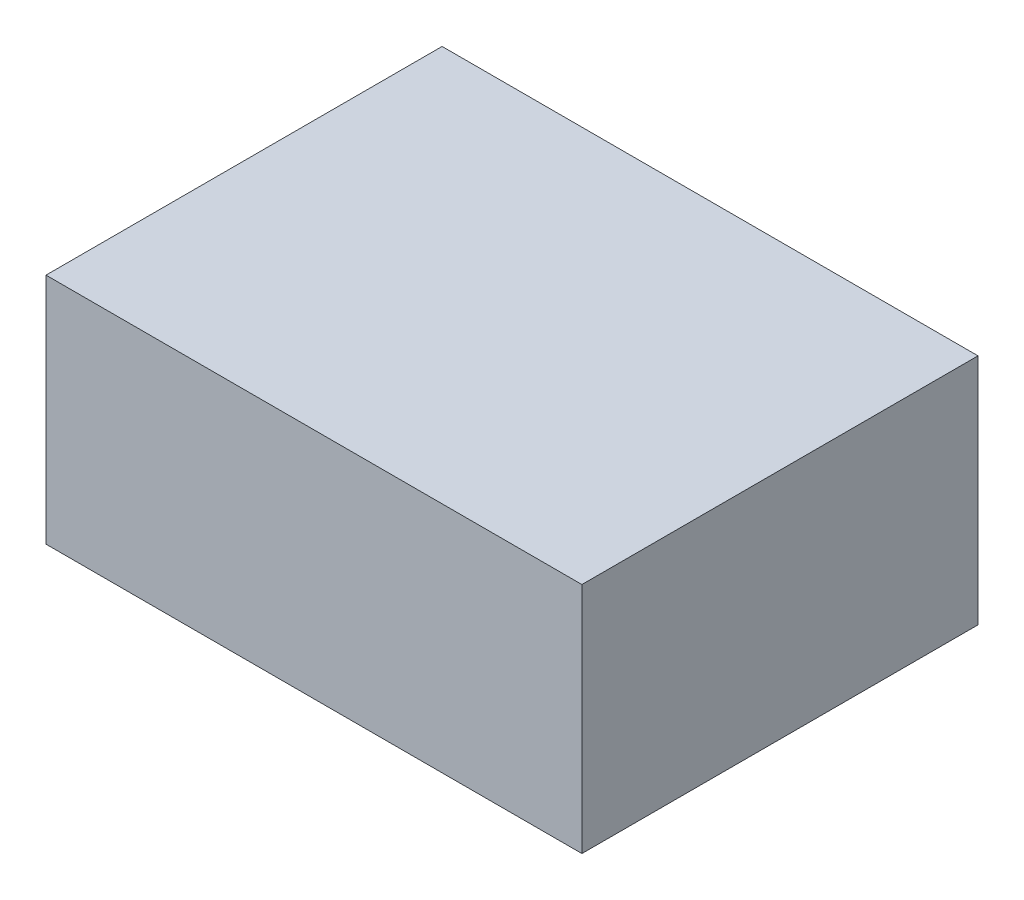
ISO-10303-21;
HEADER;
FILE_DESCRIPTION(('STEP AP214'),'2;1');
FILE_NAME('part.step','',(''),(''),'','','');
FILE_SCHEMA(('AUTOMOTIVE_DESIGN { 1 0 10303 214 1 1 1 1 }'));
ENDSEC;
DATA;
#1=APPLICATION_CONTEXT('core data for automotive mechanical design processes');
#2=APPLICATION_PROTOCOL_DEFINITION('international standard','automotive_design',2000,#1);
#3=PRODUCT_CONTEXT('',#1,'mechanical');
#4=PRODUCT('Part','Part','',(#3));
#5=PRODUCT_RELATED_PRODUCT_CATEGORY('part','',(#4));
#6=PRODUCT_DEFINITION_FORMATION('','',#4);
#7=PRODUCT_DEFINITION_CONTEXT('part definition',#1,'design');
#8=PRODUCT_DEFINITION('design','',#6,#7);
#9=PRODUCT_DEFINITION_SHAPE('','',#8);
#10=(LENGTH_UNIT() NAMED_UNIT(*) SI_UNIT(.MILLI.,.METRE.));
#11=(NAMED_UNIT(*) PLANE_ANGLE_UNIT() SI_UNIT($,.RADIAN.));
#12=(NAMED_UNIT(*) SI_UNIT($,.STERADIAN.) SOLID_ANGLE_UNIT());
#13=UNCERTAINTY_MEASURE_WITH_UNIT(LENGTH_MEASURE(1.E-05),#10,'distance_accuracy_value','');
#14=(GEOMETRIC_REPRESENTATION_CONTEXT(3) GLOBAL_UNCERTAINTY_ASSIGNED_CONTEXT((#13)) GLOBAL_UNIT_ASSIGNED_CONTEXT((#10,
#11,#12)) REPRESENTATION_CONTEXT('',''));
#15=CARTESIAN_POINT('',(0.,0.,0.));
#16=DIRECTION('',(0.,0.,1.));
#17=DIRECTION('',(1.,0.,0.));
#18=AXIS2_PLACEMENT_3D('',#15,#16,#17);
#19=CARTESIAN_POINT('',(0.,100.,0.));
#20=DIRECTION('',(1.,0.,0.));
#21=DIRECTION('',(0.,0.,-1.));
#22=AXIS2_PLACEMENT_3D('',#19,#20,#21);
#23=PLANE('',#22);
#24=DIRECTION('',(0.,0.,1.));
#25=VECTOR('',#24,1.);
#26=CARTESIAN_POINT('',(0.,0.,0.));
#27=LINE('',#26,#25);
#28=CARTESIAN_POINT('',(0.,0.,0.));
#29=VERTEX_POINT('',#28);
#30=CARTESIAN_POINT('',(1.36002320516582E-12,0.,170.));
#31=VERTEX_POINT('',#30);
#32=EDGE_CURVE('E110',#29,#31,#27,.T.);
#33=ORIENTED_EDGE('',*,*,#32,.T.);
#34=DIRECTION('',(0.,-1.,0.));
#35=VECTOR('',#34,1.);
#36=CARTESIAN_POINT('',(1.36002320516582E-12,100.,170.));
#37=LINE('',#36,#35);
#38=CARTESIAN_POINT('',(1.36002320516582E-12,100.,170.));
#39=VERTEX_POINT('',#38);
#40=EDGE_CURVE('E11',#39,#31,#37,.T.);
#41=ORIENTED_EDGE('',*,*,#40,.F.);
#42=DIRECTION('',(0.,0.,1.));
#43=VECTOR('',#42,1.);
#44=CARTESIAN_POINT('',(0.,100.,0.));
#45=LINE('',#44,#43);
#46=CARTESIAN_POINT('',(0.,100.,0.));
#47=VERTEX_POINT('',#46);
#48=EDGE_CURVE('E98',#47,#39,#45,.T.);
#49=ORIENTED_EDGE('',*,*,#48,.F.);
#50=DIRECTION('',(0.,-1.,0.));
#51=VECTOR('',#50,1.);
#52=CARTESIAN_POINT('',(0.,100.,0.));
#53=LINE('',#52,#51);
#54=EDGE_CURVE('E106',#47,#29,#53,.T.);
#55=ORIENTED_EDGE('',*,*,#54,.T.);
#56=EDGE_LOOP('',(#33,#41,#49,#55));
#57=FACE_BOUND('',#56,.T.);
#58=ADVANCED_FACE('F47',(#57),#23,.F.);
#59=CARTESIAN_POINT('',(1.36002320516582E-12,100.,170.));
#60=DIRECTION('',(0.,0.,-1.));
#61=DIRECTION('',(-1.,0.,0.));
#62=AXIS2_PLACEMENT_3D('',#59,#60,#61);
#63=PLANE('',#62);
#64=DIRECTION('',(1.,0.,0.));
#65=VECTOR('',#64,1.);
#66=CARTESIAN_POINT('',(1.36002320516582E-12,0.,170.));
#67=LINE('',#66,#65);
#68=CARTESIAN_POINT('',(230.000000000001,0.,170.));
#69=VERTEX_POINT('',#68);
#70=EDGE_CURVE('E102',#31,#69,#67,.T.);
#71=ORIENTED_EDGE('',*,*,#70,.T.);
#72=DIRECTION('',(0.,-1.,0.));
#73=VECTOR('',#72,1.);
#74=CARTESIAN_POINT('',(230.000000000001,100.,170.));
#75=LINE('',#74,#73);
#76=CARTESIAN_POINT('',(230.000000000001,100.,170.));
#77=VERTEX_POINT('',#76);
#78=EDGE_CURVE('E55',#77,#69,#75,.T.);
#79=ORIENTED_EDGE('',*,*,#78,.F.);
#80=DIRECTION('',(1.,0.,0.));
#81=VECTOR('',#80,1.);
#82=CARTESIAN_POINT('',(1.36002320516582E-12,100.,170.));
#83=LINE('',#82,#81);
#84=EDGE_CURVE('E93',#39,#77,#83,.T.);
#85=ORIENTED_EDGE('',*,*,#84,.F.);
#86=ORIENTED_EDGE('',*,*,#40,.T.);
#87=EDGE_LOOP('',(#71,#79,#85,#86));
#88=FACE_BOUND('',#87,.T.);
#89=ADVANCED_FACE('F101',(#88),#63,.F.);
#90=CARTESIAN_POINT('',(230.000000000001,100.,0.));
#91=DIRECTION('',(-1.,0.,0.));
#92=DIRECTION('',(0.,0.,1.));
#93=AXIS2_PLACEMENT_3D('',#90,#91,#92);
#94=PLANE('',#93);
#95=DIRECTION('',(0.,0.,-1.));
#96=VECTOR('',#95,1.);
#97=CARTESIAN_POINT('',(230.000000000001,0.,0.));
#98=LINE('',#97,#96);
#99=CARTESIAN_POINT('',(230.000000000001,0.,0.));
#100=VERTEX_POINT('',#99);
#101=EDGE_CURVE('E80',#69,#100,#98,.T.);
#102=ORIENTED_EDGE('',*,*,#101,.T.);
#103=DIRECTION('',(0.,-1.,0.));
#104=VECTOR('',#103,1.);
#105=CARTESIAN_POINT('',(230.000000000001,100.,0.));
#106=LINE('',#105,#104);
#107=CARTESIAN_POINT('',(230.000000000001,100.,0.));
#108=VERTEX_POINT('',#107);
#109=EDGE_CURVE('E103',#108,#100,#106,.T.);
#110=ORIENTED_EDGE('',*,*,#109,.F.);
#111=DIRECTION('',(0.,0.,-1.));
#112=VECTOR('',#111,1.);
#113=CARTESIAN_POINT('',(230.000000000001,100.,0.));
#114=LINE('',#113,#112);
#115=EDGE_CURVE('E96',#77,#108,#114,.T.);
#116=ORIENTED_EDGE('',*,*,#115,.F.);
#117=ORIENTED_EDGE('',*,*,#78,.T.);
#118=EDGE_LOOP('',(#102,#110,#116,#117));
#119=FACE_BOUND('',#118,.T.);
#120=ADVANCED_FACE('F104',(#119),#94,.F.);
#121=CARTESIAN_POINT('',(0.,100.,0.));
#122=DIRECTION('',(0.,0.,1.));
#123=DIRECTION('',(1.,0.,0.));
#124=AXIS2_PLACEMENT_3D('',#121,#122,#123);
#125=PLANE('',#124);
#126=DIRECTION('',(-1.,0.,0.));
#127=VECTOR('',#126,1.);
#128=CARTESIAN_POINT('',(0.,0.,0.));
#129=LINE('',#128,#127);
#130=EDGE_CURVE('E86',#100,#29,#129,.T.);
#131=ORIENTED_EDGE('',*,*,#130,.T.);
#132=ORIENTED_EDGE('',*,*,#54,.F.);
#133=DIRECTION('',(-1.,0.,0.));
#134=VECTOR('',#133,1.);
#135=CARTESIAN_POINT('',(0.,100.,0.));
#136=LINE('',#135,#134);
#137=EDGE_CURVE('E63',#108,#47,#136,.T.);
#138=ORIENTED_EDGE('',*,*,#137,.F.);
#139=ORIENTED_EDGE('',*,*,#109,.T.);
#140=EDGE_LOOP('',(#131,#132,#138,#139));
#141=FACE_BOUND('',#140,.T.);
#142=ADVANCED_FACE('F117',(#141),#125,.F.);
#143=CARTESIAN_POINT('',(0.,100.,0.));
#144=DIRECTION('',(0.,1.,0.));
#145=DIRECTION('',(0.,0.,1.));
#146=AXIS2_PLACEMENT_3D('',#143,#144,#145);
#147=PLANE('',#146);
#148=ORIENTED_EDGE('',*,*,#48,.T.);
#149=ORIENTED_EDGE('',*,*,#84,.T.);
#150=ORIENTED_EDGE('',*,*,#115,.T.);
#151=ORIENTED_EDGE('',*,*,#137,.T.);
#152=EDGE_LOOP('',(#148,#149,#150,#151));
#153=FACE_BOUND('',#152,.T.);
#154=ADVANCED_FACE('F94',(#153),#147,.T.);
#155=CARTESIAN_POINT('',(0.,0.,0.));
#156=DIRECTION('',(0.,1.,0.));
#157=DIRECTION('',(0.,0.,1.));
#158=AXIS2_PLACEMENT_3D('',#155,#156,#157);
#159=PLANE('',#158);
#160=ORIENTED_EDGE('',*,*,#32,.F.);
#161=ORIENTED_EDGE('',*,*,#130,.F.);
#162=ORIENTED_EDGE('',*,*,#101,.F.);
#163=ORIENTED_EDGE('',*,*,#70,.F.);
#164=EDGE_LOOP('',(#160,#161,#162,#163));
#165=FACE_BOUND('',#164,.T.);
#166=ADVANCED_FACE('F120',(#165),#159,.F.);
#167=CLOSED_SHELL('',(#58,#89,#120,#142,#154,#166));
#168=MANIFOLD_SOLID_BREP('B2',#167);
#169=ADVANCED_BREP_SHAPE_REPRESENTATION('',(#18,#168),#14);
#170=SHAPE_DEFINITION_REPRESENTATION(#9,#169);
ENDSEC;
END-ISO-10303-21;
